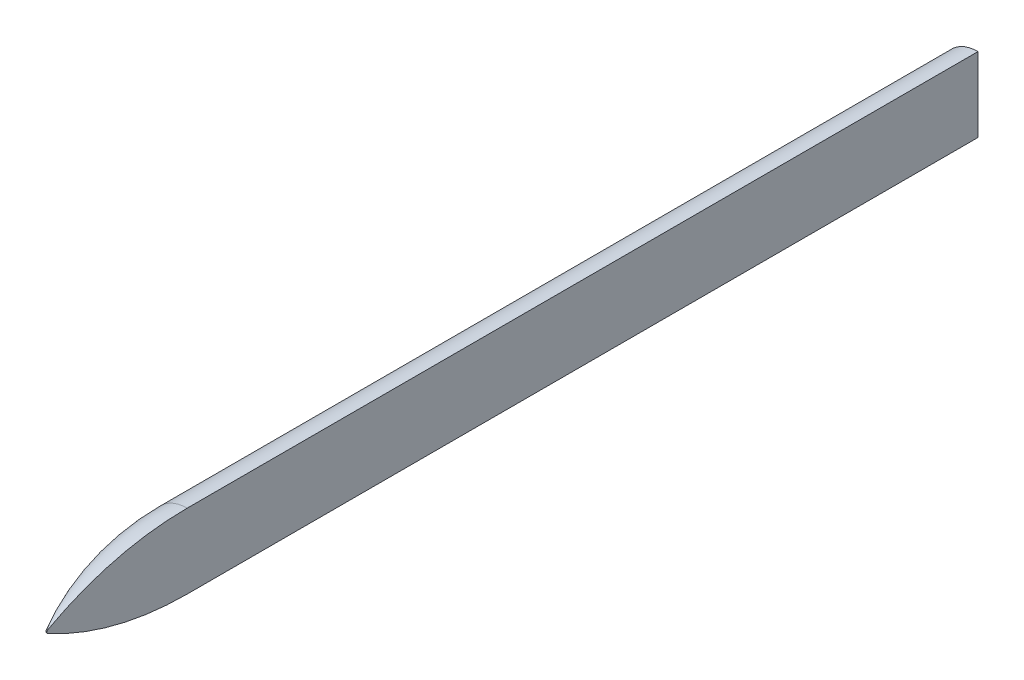
ISO-10303-21;
HEADER;
FILE_DESCRIPTION(('STEP AP214'),'2;1');
FILE_NAME('part.step','',(''),(''),'','','');
FILE_SCHEMA(('AUTOMOTIVE_DESIGN { 1 0 10303 214 1 1 1 1 }'));
ENDSEC;
DATA;
#1=APPLICATION_CONTEXT('core data for automotive mechanical design processes');
#2=APPLICATION_PROTOCOL_DEFINITION('international standard','automotive_design',2000,#1);
#3=PRODUCT_CONTEXT('',#1,'mechanical');
#4=PRODUCT('Part','Part','',(#3));
#5=PRODUCT_RELATED_PRODUCT_CATEGORY('part','',(#4));
#6=PRODUCT_DEFINITION_FORMATION('','',#4);
#7=PRODUCT_DEFINITION_CONTEXT('part definition',#1,'design');
#8=PRODUCT_DEFINITION('design','',#6,#7);
#9=PRODUCT_DEFINITION_SHAPE('','',#8);
#10=(LENGTH_UNIT() NAMED_UNIT(*) SI_UNIT(.MILLI.,.METRE.));
#11=(NAMED_UNIT(*) PLANE_ANGLE_UNIT() SI_UNIT($,.RADIAN.));
#12=(NAMED_UNIT(*) SI_UNIT($,.STERADIAN.) SOLID_ANGLE_UNIT());
#13=UNCERTAINTY_MEASURE_WITH_UNIT(LENGTH_MEASURE(1.E-05),#10,'distance_accuracy_value','');
#14=(GEOMETRIC_REPRESENTATION_CONTEXT(3) GLOBAL_UNCERTAINTY_ASSIGNED_CONTEXT((#13)) GLOBAL_UNIT_ASSIGNED_CONTEXT((#10,
#11,#12)) REPRESENTATION_CONTEXT('',''));
#15=CARTESIAN_POINT('',(0.,0.,0.));
#16=DIRECTION('',(0.,0.,1.));
#17=DIRECTION('',(1.,0.,0.));
#18=AXIS2_PLACEMENT_3D('',#15,#16,#17);
#19=CARTESIAN_POINT('',(2.79318507107451E-13,-40.0000000000001,-500.));
#20=DIRECTION('',(0.,0.,-1.));
#21=DIRECTION('',(-1.,0.,0.));
#22=AXIS2_PLACEMENT_3D('',#19,#20,#21);
#23=PLANE('',#22);
#24=CARTESIAN_POINT('',(0.,0.,-500.));
#25=DIRECTION('',(0.,0.,-1.));
#26=DIRECTION('',(-1.,0.,0.));
#27=AXIS2_PLACEMENT_3D('',#24,#25,#26);
#28=CIRCLE('',#27,40.0000000000001);
#29=CARTESIAN_POINT('',(2.79318507107451E-13,-40.0000000000001,-500.));
#30=VERTEX_POINT('',#29);
#31=CARTESIAN_POINT('',(0.,40.0000000000001,-500.));
#32=VERTEX_POINT('',#31);
#33=EDGE_CURVE('E11',#30,#32,#28,.T.);
#34=ORIENTED_EDGE('',*,*,#33,.T.);
#35=DIRECTION('',(0.,-1.,0.));
#36=VECTOR('',#35,1.);
#37=CARTESIAN_POINT('',(2.79318507107451E-13,-40.0000000000001,-500.));
#38=LINE('',#37,#36);
#39=EDGE_CURVE('E81',#32,#30,#38,.T.);
#40=ORIENTED_EDGE('',*,*,#39,.T.);
#41=EDGE_LOOP('',(#34,#40));
#42=FACE_BOUND('',#41,.T.);
#43=ADVANCED_FACE('F45',(#42),#23,.T.);
#44=CARTESIAN_POINT('',(0.,0.,0.));
#45=DIRECTION('',(0.,0.,-1.));
#46=DIRECTION('',(-1.,0.,0.));
#47=AXIS2_PLACEMENT_3D('',#44,#45,#46);
#48=CYLINDRICAL_SURFACE('',#47,40.);
#49=CARTESIAN_POINT('',(0.,0.,350.));
#50=DIRECTION('',(0.,0.,-1.));
#51=DIRECTION('',(-1.,0.,0.));
#52=AXIS2_PLACEMENT_3D('',#49,#50,#51);
#53=CIRCLE('',#52,40.);
#54=CARTESIAN_POINT('',(2.79318507107451E-13,-40.,350.));
#55=VERTEX_POINT('',#54);
#56=CARTESIAN_POINT('',(0.,40.,350.));
#57=VERTEX_POINT('',#56);
#58=EDGE_CURVE('E54',#55,#57,#53,.T.);
#59=ORIENTED_EDGE('',*,*,#58,.T.);
#60=DIRECTION('',(0.,0.,1.));
#61=VECTOR('',#60,1.);
#62=CARTESIAN_POINT('',(0.,40.0000000000001,-500.));
#63=LINE('',#62,#61);
#64=EDGE_CURVE('E85',#32,#57,#63,.T.);
#65=ORIENTED_EDGE('',*,*,#64,.F.);
#66=ORIENTED_EDGE('',*,*,#33,.F.);
#67=DIRECTION('',(0.,0.,1.));
#68=VECTOR('',#67,1.);
#69=CARTESIAN_POINT('',(2.79318507107451E-13,-40.0000000000001,-500.));
#70=LINE('',#69,#68);
#71=EDGE_CURVE('E87',#30,#55,#70,.T.);
#72=ORIENTED_EDGE('',*,*,#71,.T.);
#73=EDGE_LOOP('',(#59,#65,#66,#72));
#74=FACE_BOUND('',#73,.T.);
#75=ADVANCED_FACE('F47',(#74),#48,.T.);
#76=CARTESIAN_POINT('',(0.,0.,350.));
#77=DIRECTION('',(0.,0.,-1.));
#78=DIRECTION('',(-1.,0.,0.));
#79=AXIS2_PLACEMENT_3D('',#76,#77,#78);
#80=DEGENERATE_TOROIDAL_SURFACE('',#79,272.784064971399,312.784064971399,.F.);
#81=CARTESIAN_POINT('',(0.,0.,500.));
#82=DIRECTION('',(0.,0.,-1.));
#83=DIRECTION('',(-1.,0.,0.));
#84=AXIS2_PLACEMENT_3D('',#81,#82,#83);
#85=CIRCLE('',#84,1.68609970963191);
#86=CARTESIAN_POINT('',(0.,-1.68609970963191,500.));
#87=VERTEX_POINT('',#86);
#88=CARTESIAN_POINT('',(0.,1.68609970963191,500.));
#89=VERTEX_POINT('',#88);
#90=EDGE_CURVE('E60',#87,#89,#85,.T.);
#91=ORIENTED_EDGE('',*,*,#90,.T.);
#92=CARTESIAN_POINT('',(0.,-272.784064971399,350.));
#93=DIRECTION('',(1.,0.,0.));
#94=DIRECTION('',(0.,0.,-1.));
#95=AXIS2_PLACEMENT_3D('',#92,#93,#94);
#96=CIRCLE('',#95,312.784064971399);
#97=EDGE_CURVE('E90',#57,#89,#96,.T.);
#98=ORIENTED_EDGE('',*,*,#97,.F.);
#99=ORIENTED_EDGE('',*,*,#58,.F.);
#100=CARTESIAN_POINT('',(-1.90484094476282E-12,272.784064971399,350.));
#101=DIRECTION('',(-1.,0.,0.));
#102=DIRECTION('',(0.,0.,-1.));
#103=AXIS2_PLACEMENT_3D('',#100,#101,#102);
#104=CIRCLE('',#103,312.784064971399);
#105=EDGE_CURVE('E100',#55,#87,#104,.T.);
#106=ORIENTED_EDGE('',*,*,#105,.T.);
#107=EDGE_LOOP('',(#91,#98,#99,#106));
#108=FACE_BOUND('',#107,.T.);
#109=ADVANCED_FACE('F108',(#108),#80,.F.);
#110=CARTESIAN_POINT('',(0.,2.15546188894357E-13,499.078533884589));
#111=DIRECTION('',(0.,0.,-1.));
#112=DIRECTION('',(0.,-1.,0.));
#113=AXIS2_PLACEMENT_3D('',#110,#111,#112);
#114=SPHERICAL_SURFACE('',#113,1.92146611541075);
#115=CARTESIAN_POINT('',(0.,2.15546188894357E-13,499.078533884589));
#116=DIRECTION('',(-1.,0.,0.));
#117=DIRECTION('',(0.,0.,-1.));
#118=AXIS2_PLACEMENT_3D('',#115,#116,#117);
#119=CIRCLE('',#118,1.92146611541075);
#120=EDGE_CURVE('E103',#87,#89,#119,.T.);
#121=ORIENTED_EDGE('',*,*,#120,.T.);
#122=ORIENTED_EDGE('',*,*,#90,.F.);
#123=EDGE_LOOP('',(#121,#122));
#124=FACE_BOUND('',#123,.T.);
#125=ADVANCED_FACE('F110',(#124),#114,.T.);
#126=CARTESIAN_POINT('',(0.,2.15546188894357E-13,499.078533884589));
#127=DIRECTION('',(-1.,0.,0.));
#128=DIRECTION('',(0.,0.,-1.));
#129=AXIS2_PLACEMENT_3D('',#126,#127,#128);
#130=PLANE('',#129);
#131=ORIENTED_EDGE('',*,*,#39,.F.);
#132=ORIENTED_EDGE('',*,*,#64,.T.);
#133=ORIENTED_EDGE('',*,*,#97,.T.);
#134=ORIENTED_EDGE('',*,*,#120,.F.);
#135=ORIENTED_EDGE('',*,*,#105,.F.);
#136=ORIENTED_EDGE('',*,*,#71,.F.);
#137=EDGE_LOOP('',(#131,#132,#133,#134,#135,#136));
#138=FACE_BOUND('',#137,.T.);
#139=ADVANCED_FACE('F82',(#138),#130,.F.);
#140=CLOSED_SHELL('',(#43,#75,#109,#125,#139));
#141=MANIFOLD_SOLID_BREP('B2',#140);
#142=ADVANCED_BREP_SHAPE_REPRESENTATION('',(#18,#141),#14);
#143=SHAPE_DEFINITION_REPRESENTATION(#9,#142);
ENDSEC;
END-ISO-10303-21;
